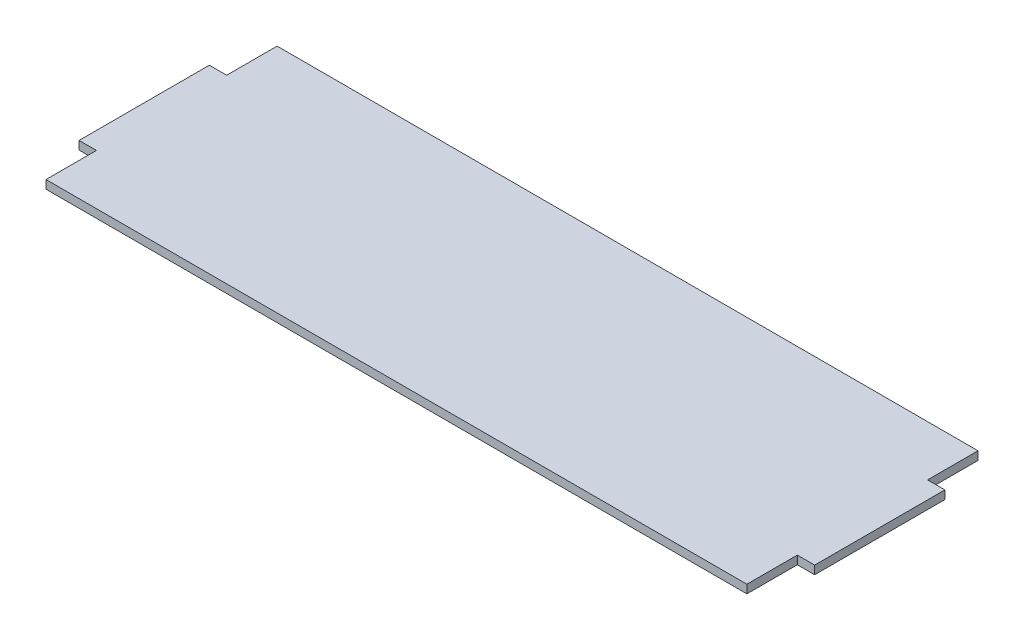
ISO-10303-21;
HEADER;
FILE_DESCRIPTION(('STEP AP214'),'2;1');
FILE_NAME('part.step','',(''),(''),'','','');
FILE_SCHEMA(('AUTOMOTIVE_DESIGN { 1 0 10303 214 1 1 1 1 }'));
ENDSEC;
DATA;
#1=APPLICATION_CONTEXT('core data for automotive mechanical design processes');
#2=APPLICATION_PROTOCOL_DEFINITION('international standard','automotive_design',2000,#1);
#3=PRODUCT_CONTEXT('',#1,'mechanical');
#4=PRODUCT('Part','Part','',(#3));
#5=PRODUCT_RELATED_PRODUCT_CATEGORY('part','',(#4));
#6=PRODUCT_DEFINITION_FORMATION('','',#4);
#7=PRODUCT_DEFINITION_CONTEXT('part definition',#1,'design');
#8=PRODUCT_DEFINITION('design','',#6,#7);
#9=PRODUCT_DEFINITION_SHAPE('','',#8);
#10=(LENGTH_UNIT() NAMED_UNIT(*) SI_UNIT(.MILLI.,.METRE.));
#11=(NAMED_UNIT(*) PLANE_ANGLE_UNIT() SI_UNIT($,.RADIAN.));
#12=(NAMED_UNIT(*) SI_UNIT($,.STERADIAN.) SOLID_ANGLE_UNIT());
#13=UNCERTAINTY_MEASURE_WITH_UNIT(LENGTH_MEASURE(1.E-05),#10,'distance_accuracy_value','');
#14=(GEOMETRIC_REPRESENTATION_CONTEXT(3) GLOBAL_UNCERTAINTY_ASSIGNED_CONTEXT((#13)) GLOBAL_UNIT_ASSIGNED_CONTEXT((#10,
#11,#12)) REPRESENTATION_CONTEXT('',''));
#15=CARTESIAN_POINT('',(0.,0.,0.));
#16=DIRECTION('',(0.,0.,1.));
#17=DIRECTION('',(1.,0.,0.));
#18=AXIS2_PLACEMENT_3D('',#15,#16,#17);
#19=CARTESIAN_POINT('',(-520.28725,2.54,228.6));
#20=DIRECTION('',(-1.,0.,0.));
#21=DIRECTION('',(0.,0.,1.));
#22=AXIS2_PLACEMENT_3D('',#19,#20,#21);
#23=PLANE('',#22);
#24=DIRECTION('',(0.,0.,-1.));
#25=VECTOR('',#24,1.);
#26=CARTESIAN_POINT('',(-520.28725,0.,228.6));
#27=LINE('',#26,#25);
#28=CARTESIAN_POINT('',(-520.28725,0.,243.84));
#29=VERTEX_POINT('',#28);
#30=CARTESIAN_POINT('',(-520.28725,0.,228.6));
#31=VERTEX_POINT('',#30);
#32=EDGE_CURVE('E154',#29,#31,#27,.T.);
#33=ORIENTED_EDGE('',*,*,#32,.T.);
#34=DIRECTION('',(0.,-1.,0.));
#35=VECTOR('',#34,1.);
#36=CARTESIAN_POINT('',(-520.28725,2.54,228.6));
#37=LINE('',#36,#35);
#38=CARTESIAN_POINT('',(-520.28725,2.54,228.6));
#39=VERTEX_POINT('',#38);
#40=EDGE_CURVE('E11',#39,#31,#37,.T.);
#41=ORIENTED_EDGE('',*,*,#40,.F.);
#42=DIRECTION('',(0.,0.,-1.));
#43=VECTOR('',#42,1.);
#44=CARTESIAN_POINT('',(-520.28725,2.54,228.6));
#45=LINE('',#44,#43);
#46=CARTESIAN_POINT('',(-520.28725,2.54,243.84));
#47=VERTEX_POINT('',#46);
#48=EDGE_CURVE('E176',#47,#39,#45,.T.);
#49=ORIENTED_EDGE('',*,*,#48,.F.);
#50=DIRECTION('',(0.,-1.,0.));
#51=VECTOR('',#50,1.);
#52=CARTESIAN_POINT('',(-520.28725,2.54,243.84));
#53=LINE('',#52,#51);
#54=EDGE_CURVE('E150',#47,#29,#53,.T.);
#55=ORIENTED_EDGE('',*,*,#54,.T.);
#56=EDGE_LOOP('',(#33,#41,#49,#55));
#57=FACE_BOUND('',#56,.T.);
#58=ADVANCED_FACE('F34',(#57),#23,.F.);
#59=CARTESIAN_POINT('',(-515.0485,2.54,228.6));
#60=DIRECTION('',(0.,0.,-1.));
#61=DIRECTION('',(-1.,0.,0.));
#62=AXIS2_PLACEMENT_3D('',#59,#60,#61);
#63=PLANE('',#62);
#64=DIRECTION('',(1.,0.,0.));
#65=VECTOR('',#64,1.);
#66=CARTESIAN_POINT('',(-515.0485,0.,228.6));
#67=LINE('',#66,#65);
#68=CARTESIAN_POINT('',(-515.0485,0.,228.6));
#69=VERTEX_POINT('',#68);
#70=EDGE_CURVE('E157',#31,#69,#67,.T.);
#71=ORIENTED_EDGE('',*,*,#70,.T.);
#72=DIRECTION('',(0.,-1.,0.));
#73=VECTOR('',#72,1.);
#74=CARTESIAN_POINT('',(-515.0485,2.54,228.6));
#75=LINE('',#74,#73);
#76=CARTESIAN_POINT('',(-515.0485,2.54,228.6));
#77=VERTEX_POINT('',#76);
#78=EDGE_CURVE('E42',#77,#69,#75,.T.);
#79=ORIENTED_EDGE('',*,*,#78,.F.);
#80=DIRECTION('',(1.,0.,0.));
#81=VECTOR('',#80,1.);
#82=CARTESIAN_POINT('',(-515.0485,2.54,228.6));
#83=LINE('',#82,#81);
#84=EDGE_CURVE('E105',#39,#77,#83,.T.);
#85=ORIENTED_EDGE('',*,*,#84,.F.);
#86=ORIENTED_EDGE('',*,*,#40,.T.);
#87=EDGE_LOOP('',(#71,#79,#85,#86));
#88=FACE_BOUND('',#87,.T.);
#89=ADVANCED_FACE('F254',(#88),#63,.F.);
#90=CARTESIAN_POINT('',(-515.0485,2.54,189.23));
#91=DIRECTION('',(-1.,0.,0.));
#92=DIRECTION('',(0.,0.,1.));
#93=AXIS2_PLACEMENT_3D('',#90,#91,#92);
#94=PLANE('',#93);
#95=DIRECTION('',(0.,0.,-1.));
#96=VECTOR('',#95,1.);
#97=CARTESIAN_POINT('',(-515.0485,0.,189.23));
#98=LINE('',#97,#96);
#99=CARTESIAN_POINT('',(-515.0485,0.,189.23));
#100=VERTEX_POINT('',#99);
#101=EDGE_CURVE('E159',#69,#100,#98,.T.);
#102=ORIENTED_EDGE('',*,*,#101,.T.);
#103=DIRECTION('',(0.,-1.,0.));
#104=VECTOR('',#103,1.);
#105=CARTESIAN_POINT('',(-515.0485,2.54,189.23));
#106=LINE('',#105,#104);
#107=CARTESIAN_POINT('',(-515.0485,2.54,189.23));
#108=VERTEX_POINT('',#107);
#109=EDGE_CURVE('E195',#108,#100,#106,.T.);
#110=ORIENTED_EDGE('',*,*,#109,.F.);
#111=DIRECTION('',(0.,0.,-1.));
#112=VECTOR('',#111,1.);
#113=CARTESIAN_POINT('',(-515.0485,2.54,189.23));
#114=LINE('',#113,#112);
#115=EDGE_CURVE('E203',#77,#108,#114,.T.);
#116=ORIENTED_EDGE('',*,*,#115,.F.);
#117=ORIENTED_EDGE('',*,*,#78,.T.);
#118=EDGE_LOOP('',(#102,#110,#116,#117));
#119=FACE_BOUND('',#118,.T.);
#120=ADVANCED_FACE('F201',(#119),#94,.F.);
#121=CARTESIAN_POINT('',(-520.28725,2.54,189.23));
#122=DIRECTION('',(0.,0.,1.));
#123=DIRECTION('',(1.,0.,0.));
#124=AXIS2_PLACEMENT_3D('',#121,#122,#123);
#125=PLANE('',#124);
#126=DIRECTION('',(-1.,0.,0.));
#127=VECTOR('',#126,1.);
#128=CARTESIAN_POINT('',(-520.28725,0.,189.23));
#129=LINE('',#128,#127);
#130=CARTESIAN_POINT('',(-520.28725,0.,189.23));
#131=VERTEX_POINT('',#130);
#132=EDGE_CURVE('E161',#100,#131,#129,.T.);
#133=ORIENTED_EDGE('',*,*,#132,.T.);
#134=DIRECTION('',(0.,-1.,0.));
#135=VECTOR('',#134,1.);
#136=CARTESIAN_POINT('',(-520.28725,2.54,189.23));
#137=LINE('',#136,#135);
#138=CARTESIAN_POINT('',(-520.28725,2.54,189.23));
#139=VERTEX_POINT('',#138);
#140=EDGE_CURVE('E192',#139,#131,#137,.T.);
#141=ORIENTED_EDGE('',*,*,#140,.F.);
#142=DIRECTION('',(-1.,0.,0.));
#143=VECTOR('',#142,1.);
#144=CARTESIAN_POINT('',(-520.28725,2.54,189.23));
#145=LINE('',#144,#143);
#146=EDGE_CURVE('E221',#108,#139,#145,.T.);
#147=ORIENTED_EDGE('',*,*,#146,.F.);
#148=ORIENTED_EDGE('',*,*,#109,.T.);
#149=EDGE_LOOP('',(#133,#141,#147,#148));
#150=FACE_BOUND('',#149,.T.);
#151=ADVANCED_FACE('F212',(#150),#125,.F.);
#152=CARTESIAN_POINT('',(-520.28725,2.54,173.99));
#153=DIRECTION('',(-1.,0.,0.));
#154=DIRECTION('',(0.,0.,1.));
#155=AXIS2_PLACEMENT_3D('',#152,#153,#154);
#156=PLANE('',#155);
#157=DIRECTION('',(0.,0.,-1.));
#158=VECTOR('',#157,1.);
#159=CARTESIAN_POINT('',(-520.28725,0.,173.99));
#160=LINE('',#159,#158);
#161=CARTESIAN_POINT('',(-520.28725,0.,173.99));
#162=VERTEX_POINT('',#161);
#163=EDGE_CURVE('E163',#131,#162,#160,.T.);
#164=ORIENTED_EDGE('',*,*,#163,.T.);
#165=DIRECTION('',(0.,-1.,0.));
#166=VECTOR('',#165,1.);
#167=CARTESIAN_POINT('',(-520.28725,2.54,173.99));
#168=LINE('',#167,#166);
#169=CARTESIAN_POINT('',(-520.28725,2.54,173.99));
#170=VERTEX_POINT('',#169);
#171=EDGE_CURVE('E189',#170,#162,#168,.T.);
#172=ORIENTED_EDGE('',*,*,#171,.F.);
#173=DIRECTION('',(0.,0.,-1.));
#174=VECTOR('',#173,1.);
#175=CARTESIAN_POINT('',(-520.28725,2.54,173.99));
#176=LINE('',#175,#174);
#177=EDGE_CURVE('E218',#139,#170,#176,.T.);
#178=ORIENTED_EDGE('',*,*,#177,.F.);
#179=ORIENTED_EDGE('',*,*,#140,.T.);
#180=EDGE_LOOP('',(#164,#172,#178,#179));
#181=FACE_BOUND('',#180,.T.);
#182=ADVANCED_FACE('F216',(#181),#156,.F.);
#183=CARTESIAN_POINT('',(-732.12325,2.54,173.99));
#184=DIRECTION('',(0.,0.,1.));
#185=DIRECTION('',(1.,0.,0.));
#186=AXIS2_PLACEMENT_3D('',#183,#184,#185);
#187=PLANE('',#186);
#188=DIRECTION('',(-1.,0.,0.));
#189=VECTOR('',#188,1.);
#190=CARTESIAN_POINT('',(-732.12325,0.,173.99));
#191=LINE('',#190,#189);
#192=CARTESIAN_POINT('',(-732.12325,0.,173.99));
#193=VERTEX_POINT('',#192);
#194=EDGE_CURVE('E165',#162,#193,#191,.T.);
#195=ORIENTED_EDGE('',*,*,#194,.T.);
#196=DIRECTION('',(0.,-1.,0.));
#197=VECTOR('',#196,1.);
#198=CARTESIAN_POINT('',(-732.12325,2.54,173.99));
#199=LINE('',#198,#197);
#200=CARTESIAN_POINT('',(-732.12325,2.54,173.99));
#201=VERTEX_POINT('',#200);
#202=EDGE_CURVE('E186',#201,#193,#199,.T.);
#203=ORIENTED_EDGE('',*,*,#202,.F.);
#204=DIRECTION('',(-1.,0.,0.));
#205=VECTOR('',#204,1.);
#206=CARTESIAN_POINT('',(-732.12325,2.54,173.99));
#207=LINE('',#206,#205);
#208=EDGE_CURVE('E220',#170,#201,#207,.T.);
#209=ORIENTED_EDGE('',*,*,#208,.F.);
#210=ORIENTED_EDGE('',*,*,#171,.T.);
#211=EDGE_LOOP('',(#195,#203,#209,#210));
#212=FACE_BOUND('',#211,.T.);
#213=ADVANCED_FACE('F267',(#212),#187,.F.);
#214=CARTESIAN_POINT('',(-732.12325,2.54,173.99));
#215=DIRECTION('',(1.,0.,0.));
#216=DIRECTION('',(0.,0.,-1.));
#217=AXIS2_PLACEMENT_3D('',#214,#215,#216);
#218=PLANE('',#217);
#219=DIRECTION('',(0.,0.,1.));
#220=VECTOR('',#219,1.);
#221=CARTESIAN_POINT('',(-732.12325,0.,173.99));
#222=LINE('',#221,#220);
#223=CARTESIAN_POINT('',(-732.12325,0.,189.23));
#224=VERTEX_POINT('',#223);
#225=EDGE_CURVE('E167',#193,#224,#222,.T.);
#226=ORIENTED_EDGE('',*,*,#225,.T.);
#227=DIRECTION('',(0.,-1.,0.));
#228=VECTOR('',#227,1.);
#229=CARTESIAN_POINT('',(-732.12325,2.54,189.23));
#230=LINE('',#229,#228);
#231=CARTESIAN_POINT('',(-732.12325,2.54,189.23));
#232=VERTEX_POINT('',#231);
#233=EDGE_CURVE('E183',#232,#224,#230,.T.);
#234=ORIENTED_EDGE('',*,*,#233,.F.);
#235=DIRECTION('',(0.,0.,1.));
#236=VECTOR('',#235,1.);
#237=CARTESIAN_POINT('',(-732.12325,2.54,173.99));
#238=LINE('',#237,#236);
#239=EDGE_CURVE('E223',#201,#232,#238,.T.);
#240=ORIENTED_EDGE('',*,*,#239,.F.);
#241=ORIENTED_EDGE('',*,*,#202,.T.);
#242=EDGE_LOOP('',(#226,#234,#240,#241));
#243=FACE_BOUND('',#242,.T.);
#244=ADVANCED_FACE('F270',(#243),#218,.F.);
#245=CARTESIAN_POINT('',(-732.12325,2.54,189.23));
#246=DIRECTION('',(0.,0.,1.));
#247=DIRECTION('',(1.,0.,0.));
#248=AXIS2_PLACEMENT_3D('',#245,#246,#247);
#249=PLANE('',#248);
#250=DIRECTION('',(-1.,0.,0.));
#251=VECTOR('',#250,1.);
#252=CARTESIAN_POINT('',(-732.12325,0.,189.23));
#253=LINE('',#252,#251);
#254=CARTESIAN_POINT('',(-737.362,0.,189.23));
#255=VERTEX_POINT('',#254);
#256=EDGE_CURVE('E169',#224,#255,#253,.T.);
#257=ORIENTED_EDGE('',*,*,#256,.T.);
#258=DIRECTION('',(0.,-1.,0.));
#259=VECTOR('',#258,1.);
#260=CARTESIAN_POINT('',(-737.362,2.54,189.23));
#261=LINE('',#260,#259);
#262=CARTESIAN_POINT('',(-737.362,2.54,189.23));
#263=VERTEX_POINT('',#262);
#264=EDGE_CURVE('E180',#263,#255,#261,.T.);
#265=ORIENTED_EDGE('',*,*,#264,.F.);
#266=DIRECTION('',(-1.,0.,0.));
#267=VECTOR('',#266,1.);
#268=CARTESIAN_POINT('',(-732.12325,2.54,189.23));
#269=LINE('',#268,#267);
#270=EDGE_CURVE('E229',#232,#263,#269,.T.);
#271=ORIENTED_EDGE('',*,*,#270,.F.);
#272=ORIENTED_EDGE('',*,*,#233,.T.);
#273=EDGE_LOOP('',(#257,#265,#271,#272));
#274=FACE_BOUND('',#273,.T.);
#275=ADVANCED_FACE('F235',(#274),#249,.F.);
#276=CARTESIAN_POINT('',(-737.362,2.54,189.23));
#277=DIRECTION('',(1.,0.,0.));
#278=DIRECTION('',(0.,0.,-1.));
#279=AXIS2_PLACEMENT_3D('',#276,#277,#278);
#280=PLANE('',#279);
#281=DIRECTION('',(0.,0.,1.));
#282=VECTOR('',#281,1.);
#283=CARTESIAN_POINT('',(-737.362,0.,189.23));
#284=LINE('',#283,#282);
#285=CARTESIAN_POINT('',(-737.362,0.,228.6));
#286=VERTEX_POINT('',#285);
#287=EDGE_CURVE('E171',#255,#286,#284,.T.);
#288=ORIENTED_EDGE('',*,*,#287,.T.);
#289=DIRECTION('',(0.,-1.,0.));
#290=VECTOR('',#289,1.);
#291=CARTESIAN_POINT('',(-737.362,2.54,228.6));
#292=LINE('',#291,#290);
#293=CARTESIAN_POINT('',(-737.362,2.54,228.6));
#294=VERTEX_POINT('',#293);
#295=EDGE_CURVE('E145',#294,#286,#292,.T.);
#296=ORIENTED_EDGE('',*,*,#295,.F.);
#297=DIRECTION('',(0.,0.,1.));
#298=VECTOR('',#297,1.);
#299=CARTESIAN_POINT('',(-737.362,2.54,189.23));
#300=LINE('',#299,#298);
#301=EDGE_CURVE('E136',#263,#294,#300,.T.);
#302=ORIENTED_EDGE('',*,*,#301,.F.);
#303=ORIENTED_EDGE('',*,*,#264,.T.);
#304=EDGE_LOOP('',(#288,#296,#302,#303));
#305=FACE_BOUND('',#304,.T.);
#306=ADVANCED_FACE('F239',(#305),#280,.F.);
#307=CARTESIAN_POINT('',(-737.362,2.54,228.6));
#308=DIRECTION('',(0.,0.,-1.));
#309=DIRECTION('',(-1.,0.,0.));
#310=AXIS2_PLACEMENT_3D('',#307,#308,#309);
#311=PLANE('',#310);
#312=DIRECTION('',(1.,0.,0.));
#313=VECTOR('',#312,1.);
#314=CARTESIAN_POINT('',(-737.362,0.,228.6));
#315=LINE('',#314,#313);
#316=CARTESIAN_POINT('',(-732.12325,0.,228.6));
#317=VERTEX_POINT('',#316);
#318=EDGE_CURVE('E144',#286,#317,#315,.T.);
#319=ORIENTED_EDGE('',*,*,#318,.T.);
#320=DIRECTION('',(0.,-1.,0.));
#321=VECTOR('',#320,1.);
#322=CARTESIAN_POINT('',(-732.12325,2.54,228.6));
#323=LINE('',#322,#321);
#324=CARTESIAN_POINT('',(-732.12325,2.54,228.6));
#325=VERTEX_POINT('',#324);
#326=EDGE_CURVE('E141',#325,#317,#323,.T.);
#327=ORIENTED_EDGE('',*,*,#326,.F.);
#328=DIRECTION('',(1.,0.,0.));
#329=VECTOR('',#328,1.);
#330=CARTESIAN_POINT('',(-737.362,2.54,228.6));
#331=LINE('',#330,#329);
#332=EDGE_CURVE('E130',#294,#325,#331,.T.);
#333=ORIENTED_EDGE('',*,*,#332,.F.);
#334=ORIENTED_EDGE('',*,*,#295,.T.);
#335=EDGE_LOOP('',(#319,#327,#333,#334));
#336=FACE_BOUND('',#335,.T.);
#337=ADVANCED_FACE('F142',(#336),#311,.F.);
#338=CARTESIAN_POINT('',(-732.12325,2.54,228.6));
#339=DIRECTION('',(1.,0.,0.));
#340=DIRECTION('',(0.,0.,-1.));
#341=AXIS2_PLACEMENT_3D('',#338,#339,#340);
#342=PLANE('',#341);
#343=DIRECTION('',(0.,0.,1.));
#344=VECTOR('',#343,1.);
#345=CARTESIAN_POINT('',(-732.12325,0.,228.6));
#346=LINE('',#345,#344);
#347=CARTESIAN_POINT('',(-732.12325,0.,243.84));
#348=VERTEX_POINT('',#347);
#349=EDGE_CURVE('E91',#317,#348,#346,.T.);
#350=ORIENTED_EDGE('',*,*,#349,.T.);
#351=DIRECTION('',(0.,-1.,0.));
#352=VECTOR('',#351,1.);
#353=CARTESIAN_POINT('',(-732.12325,2.54,243.84));
#354=LINE('',#353,#352);
#355=CARTESIAN_POINT('',(-732.12325,2.54,243.84));
#356=VERTEX_POINT('',#355);
#357=EDGE_CURVE('E146',#356,#348,#354,.T.);
#358=ORIENTED_EDGE('',*,*,#357,.F.);
#359=DIRECTION('',(0.,0.,1.));
#360=VECTOR('',#359,1.);
#361=CARTESIAN_POINT('',(-732.12325,2.54,228.6));
#362=LINE('',#361,#360);
#363=EDGE_CURVE('E134',#325,#356,#362,.T.);
#364=ORIENTED_EDGE('',*,*,#363,.F.);
#365=ORIENTED_EDGE('',*,*,#326,.T.);
#366=EDGE_LOOP('',(#350,#358,#364,#365));
#367=FACE_BOUND('',#366,.T.);
#368=ADVANCED_FACE('F148',(#367),#342,.F.);
#369=CARTESIAN_POINT('',(-732.12325,2.54,243.84));
#370=DIRECTION('',(0.,0.,-1.));
#371=DIRECTION('',(-1.,0.,0.));
#372=AXIS2_PLACEMENT_3D('',#369,#370,#371);
#373=PLANE('',#372);
#374=DIRECTION('',(1.,0.,0.));
#375=VECTOR('',#374,1.);
#376=CARTESIAN_POINT('',(-732.12325,0.,243.84));
#377=LINE('',#376,#375);
#378=EDGE_CURVE('E97',#348,#29,#377,.T.);
#379=ORIENTED_EDGE('',*,*,#378,.T.);
#380=ORIENTED_EDGE('',*,*,#54,.F.);
#381=DIRECTION('',(1.,0.,0.));
#382=VECTOR('',#381,1.);
#383=CARTESIAN_POINT('',(-732.12325,2.54,243.84));
#384=LINE('',#383,#382);
#385=EDGE_CURVE('E50',#356,#47,#384,.T.);
#386=ORIENTED_EDGE('',*,*,#385,.F.);
#387=ORIENTED_EDGE('',*,*,#357,.T.);
#388=EDGE_LOOP('',(#379,#380,#386,#387));
#389=FACE_BOUND('',#388,.T.);
#390=ADVANCED_FACE('F243',(#389),#373,.F.);
#391=CARTESIAN_POINT('',(0.,2.54,0.));
#392=DIRECTION('',(0.,1.,0.));
#393=DIRECTION('',(0.,0.,1.));
#394=AXIS2_PLACEMENT_3D('',#391,#392,#393);
#395=PLANE('',#394);
#396=ORIENTED_EDGE('',*,*,#48,.T.);
#397=ORIENTED_EDGE('',*,*,#84,.T.);
#398=ORIENTED_EDGE('',*,*,#115,.T.);
#399=ORIENTED_EDGE('',*,*,#146,.T.);
#400=ORIENTED_EDGE('',*,*,#177,.T.);
#401=ORIENTED_EDGE('',*,*,#208,.T.);
#402=ORIENTED_EDGE('',*,*,#239,.T.);
#403=ORIENTED_EDGE('',*,*,#270,.T.);
#404=ORIENTED_EDGE('',*,*,#301,.T.);
#405=ORIENTED_EDGE('',*,*,#332,.T.);
#406=ORIENTED_EDGE('',*,*,#363,.T.);
#407=ORIENTED_EDGE('',*,*,#385,.T.);
#408=EDGE_LOOP('',(#396,#397,#398,#399,#400,#401,#402,#403,#404,#405,#406,#407));
#409=FACE_BOUND('',#408,.T.);
#410=ADVANCED_FACE('F132',(#409),#395,.T.);
#411=CARTESIAN_POINT('',(0.,0.,0.));
#412=DIRECTION('',(0.,1.,0.));
#413=DIRECTION('',(0.,0.,1.));
#414=AXIS2_PLACEMENT_3D('',#411,#412,#413);
#415=PLANE('',#414);
#416=ORIENTED_EDGE('',*,*,#32,.F.);
#417=ORIENTED_EDGE('',*,*,#378,.F.);
#418=ORIENTED_EDGE('',*,*,#349,.F.);
#419=ORIENTED_EDGE('',*,*,#318,.F.);
#420=ORIENTED_EDGE('',*,*,#287,.F.);
#421=ORIENTED_EDGE('',*,*,#256,.F.);
#422=ORIENTED_EDGE('',*,*,#225,.F.);
#423=ORIENTED_EDGE('',*,*,#194,.F.);
#424=ORIENTED_EDGE('',*,*,#163,.F.);
#425=ORIENTED_EDGE('',*,*,#132,.F.);
#426=ORIENTED_EDGE('',*,*,#101,.F.);
#427=ORIENTED_EDGE('',*,*,#70,.F.);
#428=EDGE_LOOP('',(#416,#417,#418,#419,#420,#421,#422,#423,#424,#425,#426,#427));
#429=FACE_BOUND('',#428,.T.);
#430=ADVANCED_FACE('F207',(#429),#415,.F.);
#431=CLOSED_SHELL('',(#58,#89,#120,#151,#182,#213,#244,#275,#306,#337,#368,#390,#410,#430));
#432=MANIFOLD_SOLID_BREP('B2',#431);
#433=ADVANCED_BREP_SHAPE_REPRESENTATION('',(#18,#432),#14);
#434=SHAPE_DEFINITION_REPRESENTATION(#9,#433);
ENDSEC;
END-ISO-10303-21;
